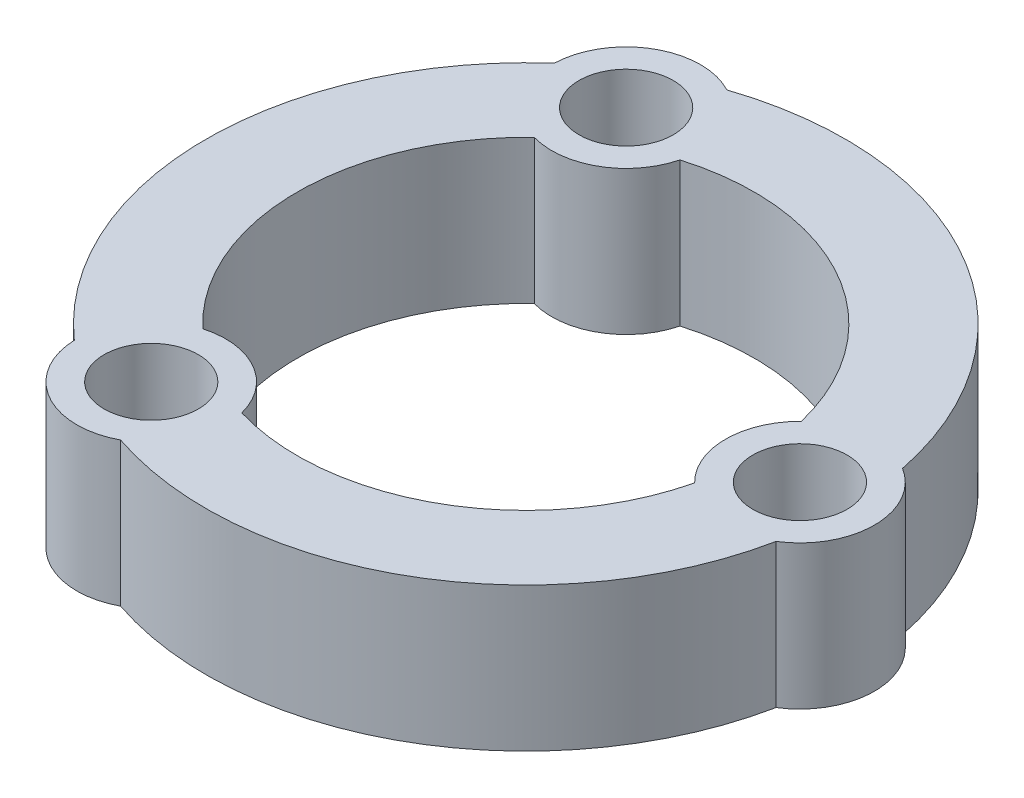
ISO-10303-21;
HEADER;
FILE_DESCRIPTION(('STEP AP214'),'2;1');
FILE_NAME('part.step','',(''),(''),'','','');
FILE_SCHEMA(('AUTOMOTIVE_DESIGN { 1 0 10303 214 1 1 1 1 }'));
ENDSEC;
DATA;
#1=APPLICATION_CONTEXT('core data for automotive mechanical design processes');
#2=APPLICATION_PROTOCOL_DEFINITION('international standard','automotive_design',2000,#1);
#3=PRODUCT_CONTEXT('',#1,'mechanical');
#4=PRODUCT('Part','Part','',(#3));
#5=PRODUCT_RELATED_PRODUCT_CATEGORY('part','',(#4));
#6=PRODUCT_DEFINITION_FORMATION('','',#4);
#7=PRODUCT_DEFINITION_CONTEXT('part definition',#1,'design');
#8=PRODUCT_DEFINITION('design','',#6,#7);
#9=PRODUCT_DEFINITION_SHAPE('','',#8);
#10=(LENGTH_UNIT() NAMED_UNIT(*) SI_UNIT(.MILLI.,.METRE.));
#11=(NAMED_UNIT(*) PLANE_ANGLE_UNIT() SI_UNIT($,.RADIAN.));
#12=(NAMED_UNIT(*) SI_UNIT($,.STERADIAN.) SOLID_ANGLE_UNIT());
#13=UNCERTAINTY_MEASURE_WITH_UNIT(LENGTH_MEASURE(1.E-05),#10,'distance_accuracy_value','');
#14=(GEOMETRIC_REPRESENTATION_CONTEXT(3) GLOBAL_UNCERTAINTY_ASSIGNED_CONTEXT((#13)) GLOBAL_UNIT_ASSIGNED_CONTEXT((#10,
#11,#12)) REPRESENTATION_CONTEXT('',''));
#15=CARTESIAN_POINT('',(0.,0.,0.));
#16=DIRECTION('',(0.,0.,1.));
#17=DIRECTION('',(1.,0.,0.));
#18=AXIS2_PLACEMENT_3D('',#15,#16,#17);
#19=CARTESIAN_POINT('',(0.,10.,0.));
#20=DIRECTION('',(0.,-1.,0.));
#21=DIRECTION('',(0.,0.,-1.));
#22=AXIS2_PLACEMENT_3D('',#19,#20,#21);
#23=CYLINDRICAL_SURFACE('',#22,22.2274999999999);
#24=CARTESIAN_POINT('',(0.,0.,0.));
#25=DIRECTION('',(0.,1.,0.));
#26=DIRECTION('',(0.,0.,1.));
#27=AXIS2_PLACEMENT_3D('',#24,#25,#26);
#28=CIRCLE('',#27,22.2274999999999);
#29=CARTESIAN_POINT('',(-14.6983234836641,0.,-16.6739630268141));
#30=VERTEX_POINT('',#29);
#31=CARTESIAN_POINT('',(-14.6983234836642,0.,16.6739630268141));
#32=VERTEX_POINT('',#31);
#33=EDGE_CURVE('E191',#30,#32,#28,.T.);
#34=ORIENTED_EDGE('',*,*,#33,.T.);
#35=DIRECTION('',(0.,-1.,0.));
#36=VECTOR('',#35,1.);
#37=CARTESIAN_POINT('',(-14.6983234836642,10.,16.6739630268141));
#38=LINE('',#37,#36);
#39=CARTESIAN_POINT('',(-14.6983234836642,10.,16.6739630268141));
#40=VERTEX_POINT('',#39);
#41=EDGE_CURVE('E13',#40,#32,#38,.T.);
#42=ORIENTED_EDGE('',*,*,#41,.F.);
#43=CARTESIAN_POINT('',(0.,10.,0.));
#44=DIRECTION('',(0.,1.,0.));
#45=DIRECTION('',(0.,0.,1.));
#46=AXIS2_PLACEMENT_3D('',#43,#44,#45);
#47=CIRCLE('',#46,22.2274999999999);
#48=CARTESIAN_POINT('',(-14.6983234836641,10.,-16.6739630268141));
#49=VERTEX_POINT('',#48);
#50=EDGE_CURVE('E256',#49,#40,#47,.T.);
#51=ORIENTED_EDGE('',*,*,#50,.F.);
#52=DIRECTION('',(0.,-1.,0.));
#53=VECTOR('',#52,1.);
#54=CARTESIAN_POINT('',(-14.6983234836641,10.,-16.6739630268141));
#55=LINE('',#54,#53);
#56=EDGE_CURVE('E202',#49,#30,#55,.T.);
#57=ORIENTED_EDGE('',*,*,#56,.T.);
#58=EDGE_LOOP('',(#34,#42,#51,#57));
#59=FACE_BOUND('',#58,.T.);
#60=ADVANCED_FACE('F48',(#59),#23,.T.);
#61=CARTESIAN_POINT('',(-9.52625,10.,16.4999490056029));
#62=DIRECTION('',(0.,-1.,0.));
#63=DIRECTION('',(0.,0.,-1.));
#64=AXIS2_PLACEMENT_3D('',#61,#62,#63);
#65=CYLINDRICAL_SURFACE('',#64,5.175);
#66=CARTESIAN_POINT('',(-9.52625,0.,16.4999490056029));
#67=DIRECTION('',(0.,1.,0.));
#68=DIRECTION('',(0.,0.,1.));
#69=AXIS2_PLACEMENT_3D('',#66,#67,#68);
#70=CIRCLE('',#69,5.175);
#71=CARTESIAN_POINT('',(-7.09091382115151,0.,21.0661030433015));
#72=VERTEX_POINT('',#71);
#73=EDGE_CURVE('E194',#32,#72,#70,.T.);
#74=ORIENTED_EDGE('',*,*,#73,.T.);
#75=DIRECTION('',(0.,-1.,0.));
#76=VECTOR('',#75,1.);
#77=CARTESIAN_POINT('',(-7.09091382115151,10.,21.0661030433015));
#78=LINE('',#77,#76);
#79=CARTESIAN_POINT('',(-7.09091382115151,10.,21.0661030433015));
#80=VERTEX_POINT('',#79);
#81=EDGE_CURVE('E58',#80,#72,#78,.T.);
#82=ORIENTED_EDGE('',*,*,#81,.F.);
#83=CARTESIAN_POINT('',(-9.52625,10.,16.4999490056029));
#84=DIRECTION('',(0.,1.,0.));
#85=DIRECTION('',(0.,0.,1.));
#86=AXIS2_PLACEMENT_3D('',#83,#84,#85);
#87=CIRCLE('',#86,5.175);
#88=EDGE_CURVE('E258',#40,#80,#87,.T.);
#89=ORIENTED_EDGE('',*,*,#88,.F.);
#90=ORIENTED_EDGE('',*,*,#41,.T.);
#91=EDGE_LOOP('',(#74,#82,#89,#90));
#92=FACE_BOUND('',#91,.T.);
#93=ADVANCED_FACE('F263',(#92),#65,.T.);
#94=CARTESIAN_POINT('',(0.,10.,0.));
#95=DIRECTION('',(0.,-1.,0.));
#96=DIRECTION('',(0.,0.,-1.));
#97=AXIS2_PLACEMENT_3D('',#94,#95,#96);
#98=CYLINDRICAL_SURFACE('',#97,22.2274999999999);
#99=CARTESIAN_POINT('',(0.,0.,0.));
#100=DIRECTION('',(0.,1.,0.));
#101=DIRECTION('',(0.,0.,1.));
#102=AXIS2_PLACEMENT_3D('',#99,#100,#101);
#103=CIRCLE('',#102,22.2274999999999);
#104=CARTESIAN_POINT('',(21.7892373048155,0.,4.39214001648747));
#105=VERTEX_POINT('',#104);
#106=EDGE_CURVE('E196',#72,#105,#103,.T.);
#107=ORIENTED_EDGE('',*,*,#106,.T.);
#108=DIRECTION('',(0.,-1.,0.));
#109=VECTOR('',#108,1.);
#110=CARTESIAN_POINT('',(21.7892373048155,10.,4.39214001648747));
#111=LINE('',#110,#109);
#112=CARTESIAN_POINT('',(21.7892373048155,10.,4.39214001648747));
#113=VERTEX_POINT('',#112);
#114=EDGE_CURVE('E163',#113,#105,#111,.T.);
#115=ORIENTED_EDGE('',*,*,#114,.F.);
#116=CARTESIAN_POINT('',(0.,10.,0.));
#117=DIRECTION('',(0.,1.,0.));
#118=DIRECTION('',(0.,0.,1.));
#119=AXIS2_PLACEMENT_3D('',#116,#117,#118);
#120=CIRCLE('',#119,22.2274999999999);
#121=EDGE_CURVE('E154',#80,#113,#120,.T.);
#122=ORIENTED_EDGE('',*,*,#121,.F.);
#123=ORIENTED_EDGE('',*,*,#81,.T.);
#124=EDGE_LOOP('',(#107,#115,#122,#123));
#125=FACE_BOUND('',#124,.T.);
#126=ADVANCED_FACE('F266',(#125),#98,.T.);
#127=CARTESIAN_POINT('',(19.0524999999998,10.,0.));
#128=DIRECTION('',(0.,-1.,0.));
#129=DIRECTION('',(0.,0.,-1.));
#130=AXIS2_PLACEMENT_3D('',#127,#128,#129);
#131=CYLINDRICAL_SURFACE('',#130,5.175);
#132=CARTESIAN_POINT('',(19.0524999999998,0.,0.));
#133=DIRECTION('',(0.,1.,0.));
#134=DIRECTION('',(0.,0.,1.));
#135=AXIS2_PLACEMENT_3D('',#132,#133,#134);
#136=CIRCLE('',#135,5.175);
#137=CARTESIAN_POINT('',(21.7892373048155,0.,-4.39214001648738));
#138=VERTEX_POINT('',#137);
#139=EDGE_CURVE('E162',#105,#138,#136,.T.);
#140=ORIENTED_EDGE('',*,*,#139,.T.);
#141=DIRECTION('',(0.,-1.,0.));
#142=VECTOR('',#141,1.);
#143=CARTESIAN_POINT('',(21.7892373048155,10.,-4.39214001648738));
#144=LINE('',#143,#142);
#145=CARTESIAN_POINT('',(21.7892373048155,10.,-4.39214001648738));
#146=VERTEX_POINT('',#145);
#147=EDGE_CURVE('E159',#146,#138,#144,.T.);
#148=ORIENTED_EDGE('',*,*,#147,.F.);
#149=CARTESIAN_POINT('',(19.0524999999998,10.,0.));
#150=DIRECTION('',(0.,1.,0.));
#151=DIRECTION('',(0.,0.,1.));
#152=AXIS2_PLACEMENT_3D('',#149,#150,#151);
#153=CIRCLE('',#152,5.175);
#154=EDGE_CURVE('E148',#113,#146,#153,.T.);
#155=ORIENTED_EDGE('',*,*,#154,.F.);
#156=ORIENTED_EDGE('',*,*,#114,.T.);
#157=EDGE_LOOP('',(#140,#148,#155,#156));
#158=FACE_BOUND('',#157,.T.);
#159=ADVANCED_FACE('F160',(#158),#131,.T.);
#160=CARTESIAN_POINT('',(0.,10.,0.));
#161=DIRECTION('',(0.,-1.,0.));
#162=DIRECTION('',(0.,0.,-1.));
#163=AXIS2_PLACEMENT_3D('',#160,#161,#162);
#164=CYLINDRICAL_SURFACE('',#163,22.2274999999999);
#165=CARTESIAN_POINT('',(0.,0.,0.));
#166=DIRECTION('',(0.,1.,0.));
#167=DIRECTION('',(0.,0.,1.));
#168=AXIS2_PLACEMENT_3D('',#165,#166,#167);
#169=CIRCLE('',#168,22.2274999999999);
#170=CARTESIAN_POINT('',(-7.09091382115139,0.,-21.0661030433016));
#171=VERTEX_POINT('',#170);
#172=EDGE_CURVE('E108',#138,#171,#169,.T.);
#173=ORIENTED_EDGE('',*,*,#172,.T.);
#174=DIRECTION('',(0.,-1.,0.));
#175=VECTOR('',#174,1.);
#176=CARTESIAN_POINT('',(-7.09091382115139,10.,-21.0661030433016));
#177=LINE('',#176,#175);
#178=CARTESIAN_POINT('',(-7.09091382115139,10.,-21.0661030433016));
#179=VERTEX_POINT('',#178);
#180=EDGE_CURVE('E164',#179,#171,#177,.T.);
#181=ORIENTED_EDGE('',*,*,#180,.F.);
#182=CARTESIAN_POINT('',(0.,10.,0.));
#183=DIRECTION('',(0.,1.,0.));
#184=DIRECTION('',(0.,0.,1.));
#185=AXIS2_PLACEMENT_3D('',#182,#183,#184);
#186=CIRCLE('',#185,22.2274999999999);
#187=EDGE_CURVE('E152',#146,#179,#186,.T.);
#188=ORIENTED_EDGE('',*,*,#187,.F.);
#189=ORIENTED_EDGE('',*,*,#147,.T.);
#190=EDGE_LOOP('',(#173,#181,#188,#189));
#191=FACE_BOUND('',#190,.T.);
#192=ADVANCED_FACE('F166',(#191),#164,.T.);
#193=CARTESIAN_POINT('',(0.,10.,0.));
#194=DIRECTION('',(0.,-1.,0.));
#195=DIRECTION('',(0.,0.,-1.));
#196=AXIS2_PLACEMENT_3D('',#193,#194,#195);
#197=CYLINDRICAL_SURFACE('',#196,15.8774999999999);
#198=CARTESIAN_POINT('',(0.,0.,0.));
#199=DIRECTION('',(0.,1.,0.));
#200=DIRECTION('',(0.,0.,1.));
#201=AXIS2_PLACEMENT_3D('',#198,#199,#200);
#202=CIRCLE('',#201,15.8774999999999);
#203=CARTESIAN_POINT('',(-4.51123615156854,0.,15.2231322215494));
#204=VERTEX_POINT('',#203);
#205=CARTESIAN_POINT('',(15.4392373048155,0.,3.70472100104573));
#206=VERTEX_POINT('',#205);
#207=EDGE_CURVE('E172',#204,#206,#202,.T.);
#208=ORIENTED_EDGE('',*,*,#207,.F.);
#209=DIRECTION('',(0.,-1.,0.));
#210=VECTOR('',#209,1.);
#211=CARTESIAN_POINT('',(-4.51123615156854,10.,15.2231322215494));
#212=LINE('',#211,#210);
#213=CARTESIAN_POINT('',(-4.51123615156854,10.,15.2231322215494));
#214=VERTEX_POINT('',#213);
#215=EDGE_CURVE('E52',#214,#204,#212,.T.);
#216=ORIENTED_EDGE('',*,*,#215,.F.);
#217=CARTESIAN_POINT('',(0.,10.,0.));
#218=DIRECTION('',(0.,1.,0.));
#219=DIRECTION('',(0.,0.,1.));
#220=AXIS2_PLACEMENT_3D('',#217,#218,#219);
#221=CIRCLE('',#220,15.8774999999999);
#222=CARTESIAN_POINT('',(15.4392373048155,10.,3.70472100104573));
#223=VERTEX_POINT('',#222);
#224=EDGE_CURVE('E201',#214,#223,#221,.T.);
#225=ORIENTED_EDGE('',*,*,#224,.T.);
#226=DIRECTION('',(0.,-1.,0.));
#227=VECTOR('',#226,1.);
#228=CARTESIAN_POINT('',(15.4392373048155,10.,3.70472100104573));
#229=LINE('',#228,#227);
#230=EDGE_CURVE('E168',#223,#206,#229,.T.);
#231=ORIENTED_EDGE('',*,*,#230,.T.);
#232=EDGE_LOOP('',(#208,#216,#225,#231));
#233=FACE_BOUND('',#232,.T.);
#234=ADVANCED_FACE('F50',(#233),#197,.F.);
#235=CARTESIAN_POINT('',(-9.52625,10.,16.4999490056029));
#236=DIRECTION('',(0.,-1.,0.));
#237=DIRECTION('',(0.,0.,-1.));
#238=AXIS2_PLACEMENT_3D('',#235,#236,#237);
#239=CYLINDRICAL_SURFACE('',#238,5.175);
#240=CARTESIAN_POINT('',(-9.52625,0.,16.4999490056029));
#241=DIRECTION('',(0.,1.,0.));
#242=DIRECTION('',(0.,0.,1.));
#243=AXIS2_PLACEMENT_3D('',#240,#241,#242);
#244=CIRCLE('',#243,5.175);
#245=CARTESIAN_POINT('',(-10.928001153247,0.,11.5184112205037));
#246=VERTEX_POINT('',#245);
#247=EDGE_CURVE('E175',#204,#246,#244,.T.);
#248=ORIENTED_EDGE('',*,*,#247,.T.);
#249=DIRECTION('',(0.,-1.,0.));
#250=VECTOR('',#249,1.);
#251=CARTESIAN_POINT('',(-10.928001153247,10.,11.5184112205037));
#252=LINE('',#251,#250);
#253=CARTESIAN_POINT('',(-10.928001153247,10.,11.5184112205037));
#254=VERTEX_POINT('',#253);
#255=EDGE_CURVE('E214',#254,#246,#252,.T.);
#256=ORIENTED_EDGE('',*,*,#255,.F.);
#257=CARTESIAN_POINT('',(-9.52625,10.,16.4999490056029));
#258=DIRECTION('',(0.,1.,0.));
#259=DIRECTION('',(0.,0.,1.));
#260=AXIS2_PLACEMENT_3D('',#257,#258,#259);
#261=CIRCLE('',#260,5.175);
#262=EDGE_CURVE('E222',#214,#254,#261,.T.);
#263=ORIENTED_EDGE('',*,*,#262,.F.);
#264=ORIENTED_EDGE('',*,*,#215,.T.);
#265=EDGE_LOOP('',(#248,#256,#263,#264));
#266=FACE_BOUND('',#265,.T.);
#267=ADVANCED_FACE('F221',(#266),#239,.T.);
#268=CARTESIAN_POINT('',(0.,10.,0.));
#269=DIRECTION('',(0.,-1.,0.));
#270=DIRECTION('',(0.,0.,-1.));
#271=AXIS2_PLACEMENT_3D('',#268,#269,#270);
#272=CYLINDRICAL_SURFACE('',#271,15.8774999999999);
#273=CARTESIAN_POINT('',(0.,0.,0.));
#274=DIRECTION('',(0.,1.,0.));
#275=DIRECTION('',(0.,0.,1.));
#276=AXIS2_PLACEMENT_3D('',#273,#274,#275);
#277=CIRCLE('',#276,15.8774999999999);
#278=CARTESIAN_POINT('',(-10.928001153247,0.,-11.5184112205038));
#279=VERTEX_POINT('',#278);
#280=EDGE_CURVE('E179',#279,#246,#277,.T.);
#281=ORIENTED_EDGE('',*,*,#280,.F.);
#282=DIRECTION('',(0.,-1.,0.));
#283=VECTOR('',#282,1.);
#284=CARTESIAN_POINT('',(-10.928001153247,10.,-11.5184112205038));
#285=LINE('',#284,#283);
#286=CARTESIAN_POINT('',(-10.928001153247,10.,-11.5184112205038));
#287=VERTEX_POINT('',#286);
#288=EDGE_CURVE('E213',#287,#279,#285,.T.);
#289=ORIENTED_EDGE('',*,*,#288,.F.);
#290=CARTESIAN_POINT('',(0.,10.,0.));
#291=DIRECTION('',(0.,1.,0.));
#292=DIRECTION('',(0.,0.,1.));
#293=AXIS2_PLACEMENT_3D('',#290,#291,#292);
#294=CIRCLE('',#293,15.8774999999999);
#295=EDGE_CURVE('E245',#287,#254,#294,.T.);
#296=ORIENTED_EDGE('',*,*,#295,.T.);
#297=ORIENTED_EDGE('',*,*,#255,.T.);
#298=EDGE_LOOP('',(#281,#289,#296,#297));
#299=FACE_BOUND('',#298,.T.);
#300=ADVANCED_FACE('F243',(#299),#272,.F.);
#301=CARTESIAN_POINT('',(-9.52624999999992,10.,-16.4999490056029));
#302=DIRECTION('',(0.,-1.,0.));
#303=DIRECTION('',(0.,0.,-1.));
#304=AXIS2_PLACEMENT_3D('',#301,#302,#303);
#305=CYLINDRICAL_SURFACE('',#304,5.175);
#306=CARTESIAN_POINT('',(-9.52624999999992,0.,-16.4999490056029));
#307=DIRECTION('',(0.,1.,0.));
#308=DIRECTION('',(0.,0.,1.));
#309=AXIS2_PLACEMENT_3D('',#306,#307,#308);
#310=CIRCLE('',#309,5.175);
#311=CARTESIAN_POINT('',(-4.51123615156845,0.,-15.2231322215494));
#312=VERTEX_POINT('',#311);
#313=EDGE_CURVE('E182',#279,#312,#310,.T.);
#314=ORIENTED_EDGE('',*,*,#313,.T.);
#315=DIRECTION('',(0.,-1.,0.));
#316=VECTOR('',#315,1.);
#317=CARTESIAN_POINT('',(-4.51123615156845,10.,-15.2231322215494));
#318=LINE('',#317,#316);
#319=CARTESIAN_POINT('',(-4.51123615156845,10.,-15.2231322215494));
#320=VERTEX_POINT('',#319);
#321=EDGE_CURVE('E211',#320,#312,#318,.T.);
#322=ORIENTED_EDGE('',*,*,#321,.F.);
#323=CARTESIAN_POINT('',(-9.52624999999992,10.,-16.4999490056029));
#324=DIRECTION('',(0.,1.,0.));
#325=DIRECTION('',(0.,0.,1.));
#326=AXIS2_PLACEMENT_3D('',#323,#324,#325);
#327=CIRCLE('',#326,5.175);
#328=EDGE_CURVE('E246',#287,#320,#327,.T.);
#329=ORIENTED_EDGE('',*,*,#328,.F.);
#330=ORIENTED_EDGE('',*,*,#288,.T.);
#331=EDGE_LOOP('',(#314,#322,#329,#330));
#332=FACE_BOUND('',#331,.T.);
#333=ADVANCED_FACE('F242',(#332),#305,.T.);
#334=CARTESIAN_POINT('',(0.,10.,0.));
#335=DIRECTION('',(0.,-1.,0.));
#336=DIRECTION('',(0.,0.,-1.));
#337=AXIS2_PLACEMENT_3D('',#334,#335,#336);
#338=CYLINDRICAL_SURFACE('',#337,15.8774999999998);
#339=CARTESIAN_POINT('',(0.,0.,0.));
#340=DIRECTION('',(0.,1.,0.));
#341=DIRECTION('',(0.,0.,1.));
#342=AXIS2_PLACEMENT_3D('',#339,#340,#341);
#343=CIRCLE('',#342,15.8774999999998);
#344=CARTESIAN_POINT('',(15.4392373048155,0.,-3.70472100104567));
#345=VERTEX_POINT('',#344);
#346=EDGE_CURVE('E185',#345,#312,#343,.T.);
#347=ORIENTED_EDGE('',*,*,#346,.F.);
#348=DIRECTION('',(0.,-1.,0.));
#349=VECTOR('',#348,1.);
#350=CARTESIAN_POINT('',(15.4392373048155,10.,-3.70472100104567));
#351=LINE('',#350,#349);
#352=CARTESIAN_POINT('',(15.4392373048155,10.,-3.70472100104567));
#353=VERTEX_POINT('',#352);
#354=EDGE_CURVE('E209',#353,#345,#351,.T.);
#355=ORIENTED_EDGE('',*,*,#354,.F.);
#356=CARTESIAN_POINT('',(0.,10.,0.));
#357=DIRECTION('',(0.,1.,0.));
#358=DIRECTION('',(0.,0.,1.));
#359=AXIS2_PLACEMENT_3D('',#356,#357,#358);
#360=CIRCLE('',#359,15.8774999999998);
#361=EDGE_CURVE('E239',#353,#320,#360,.T.);
#362=ORIENTED_EDGE('',*,*,#361,.T.);
#363=ORIENTED_EDGE('',*,*,#321,.T.);
#364=EDGE_LOOP('',(#347,#355,#362,#363));
#365=FACE_BOUND('',#364,.T.);
#366=ADVANCED_FACE('F235',(#365),#338,.F.);
#367=CARTESIAN_POINT('',(19.0524999999998,10.,0.));
#368=DIRECTION('',(0.,-1.,0.));
#369=DIRECTION('',(0.,0.,-1.));
#370=AXIS2_PLACEMENT_3D('',#367,#368,#369);
#371=CYLINDRICAL_SURFACE('',#370,5.175);
#372=CARTESIAN_POINT('',(19.0524999999998,0.,0.));
#373=DIRECTION('',(0.,1.,0.));
#374=DIRECTION('',(0.,0.,1.));
#375=AXIS2_PLACEMENT_3D('',#372,#373,#374);
#376=CIRCLE('',#375,5.175);
#377=EDGE_CURVE('E188',#345,#206,#376,.T.);
#378=ORIENTED_EDGE('',*,*,#377,.T.);
#379=ORIENTED_EDGE('',*,*,#230,.F.);
#380=CARTESIAN_POINT('',(19.0524999999998,10.,0.));
#381=DIRECTION('',(0.,1.,0.));
#382=DIRECTION('',(0.,0.,1.));
#383=AXIS2_PLACEMENT_3D('',#380,#381,#382);
#384=CIRCLE('',#383,5.175);
#385=EDGE_CURVE('E254',#353,#223,#384,.T.);
#386=ORIENTED_EDGE('',*,*,#385,.F.);
#387=ORIENTED_EDGE('',*,*,#354,.T.);
#388=EDGE_LOOP('',(#378,#379,#386,#387));
#389=FACE_BOUND('',#388,.T.);
#390=ADVANCED_FACE('F232',(#389),#371,.T.);
#391=CARTESIAN_POINT('',(-9.52624999999992,10.,-16.4999490056029));
#392=DIRECTION('',(0.,-1.,0.));
#393=DIRECTION('',(0.,0.,-1.));
#394=AXIS2_PLACEMENT_3D('',#391,#392,#393);
#395=CYLINDRICAL_SURFACE('',#394,5.175);
#396=CARTESIAN_POINT('',(-9.52624999999992,0.,-16.4999490056029));
#397=DIRECTION('',(0.,1.,0.));
#398=DIRECTION('',(0.,0.,1.));
#399=AXIS2_PLACEMENT_3D('',#396,#397,#398);
#400=CIRCLE('',#399,5.175);
#401=EDGE_CURVE('E114',#171,#30,#400,.T.);
#402=ORIENTED_EDGE('',*,*,#401,.T.);
#403=ORIENTED_EDGE('',*,*,#56,.F.);
#404=CARTESIAN_POINT('',(-9.52624999999992,10.,-16.4999490056029));
#405=DIRECTION('',(0.,1.,0.));
#406=DIRECTION('',(0.,0.,1.));
#407=AXIS2_PLACEMENT_3D('',#404,#405,#406);
#408=CIRCLE('',#407,5.175);
#409=EDGE_CURVE('E67',#179,#49,#408,.T.);
#410=ORIENTED_EDGE('',*,*,#409,.F.);
#411=ORIENTED_EDGE('',*,*,#180,.T.);
#412=EDGE_LOOP('',(#402,#403,#410,#411));
#413=FACE_BOUND('',#412,.T.);
#414=ADVANCED_FACE('F269',(#413),#395,.T.);
#415=CARTESIAN_POINT('',(0.,10.,0.));
#416=DIRECTION('',(0.,1.,0.));
#417=DIRECTION('',(0.,0.,1.));
#418=AXIS2_PLACEMENT_3D('',#415,#416,#417);
#419=PLANE('',#418);
#420=CARTESIAN_POINT('',(-9.52624999999981,10.,16.499949005603));
#421=DIRECTION('',(0.,1.,0.));
#422=DIRECTION('',(-0.866025403784443,0.,-0.499999999999992));
#423=AXIS2_PLACEMENT_3D('',#420,#421,#422);
#424=CIRCLE('',#423,3.275);
#425=CARTESIAN_POINT('',(-12.3624831973939,10.,14.862449005603));
#426=VERTEX_POINT('',#425);
#427=EDGE_CURVE('E435',#426,#426,#424,.T.);
#428=ORIENTED_EDGE('',*,*,#427,.F.);
#429=EDGE_LOOP('',(#428));
#430=FACE_BOUND('',#429,.T.);
#431=CARTESIAN_POINT('',(-9.52624999999997,10.,-16.4999490056029));
#432=DIRECTION('',(0.,1.,0.));
#433=DIRECTION('',(0.866025403784436,0.,-0.500000000000004));
#434=AXIS2_PLACEMENT_3D('',#431,#432,#433);
#435=CIRCLE('',#434,3.275);
#436=CARTESIAN_POINT('',(-6.69001680260594,10.,-18.1374490056029));
#437=VERTEX_POINT('',#436);
#438=EDGE_CURVE('E434',#437,#437,#435,.T.);
#439=ORIENTED_EDGE('',*,*,#438,.F.);
#440=EDGE_LOOP('',(#439));
#441=FACE_BOUND('',#440,.T.);
#442=CARTESIAN_POINT('',(19.0524999999998,10.,0.));
#443=DIRECTION('',(0.,1.,0.));
#444=DIRECTION('',(0.,0.,1.));
#445=AXIS2_PLACEMENT_3D('',#442,#443,#444);
#446=CIRCLE('',#445,3.275);
#447=CARTESIAN_POINT('',(19.0524999999998,10.,3.27500000000004));
#448=VERTEX_POINT('',#447);
#449=EDGE_CURVE('E444',#448,#448,#446,.T.);
#450=ORIENTED_EDGE('',*,*,#449,.F.);
#451=EDGE_LOOP('',(#450));
#452=FACE_BOUND('',#451,.T.);
#453=ORIENTED_EDGE('',*,*,#224,.F.);
#454=ORIENTED_EDGE('',*,*,#262,.T.);
#455=ORIENTED_EDGE('',*,*,#295,.F.);
#456=ORIENTED_EDGE('',*,*,#328,.T.);
#457=ORIENTED_EDGE('',*,*,#361,.F.);
#458=ORIENTED_EDGE('',*,*,#385,.T.);
#459=EDGE_LOOP('',(#453,#454,#455,#456,#457,#458));
#460=FACE_BOUND('',#459,.T.);
#461=ORIENTED_EDGE('',*,*,#50,.T.);
#462=ORIENTED_EDGE('',*,*,#88,.T.);
#463=ORIENTED_EDGE('',*,*,#121,.T.);
#464=ORIENTED_EDGE('',*,*,#154,.T.);
#465=ORIENTED_EDGE('',*,*,#187,.T.);
#466=ORIENTED_EDGE('',*,*,#409,.T.);
#467=EDGE_LOOP('',(#461,#462,#463,#464,#465,#466));
#468=FACE_BOUND('',#467,.T.);
#469=ADVANCED_FACE('F150',(#430,#441,#452,#460,#468),#419,.T.);
#470=CARTESIAN_POINT('',(0.,0.,0.));
#471=DIRECTION('',(0.,1.,0.));
#472=DIRECTION('',(0.,0.,1.));
#473=AXIS2_PLACEMENT_3D('',#470,#471,#472);
#474=PLANE('',#473);
#475=ORIENTED_EDGE('',*,*,#207,.T.);
#476=ORIENTED_EDGE('',*,*,#377,.F.);
#477=ORIENTED_EDGE('',*,*,#346,.T.);
#478=ORIENTED_EDGE('',*,*,#313,.F.);
#479=ORIENTED_EDGE('',*,*,#280,.T.);
#480=ORIENTED_EDGE('',*,*,#247,.F.);
#481=EDGE_LOOP('',(#475,#476,#477,#478,#479,#480));
#482=FACE_BOUND('',#481,.T.);
#483=ORIENTED_EDGE('',*,*,#33,.F.);
#484=ORIENTED_EDGE('',*,*,#401,.F.);
#485=ORIENTED_EDGE('',*,*,#172,.F.);
#486=ORIENTED_EDGE('',*,*,#139,.F.);
#487=ORIENTED_EDGE('',*,*,#106,.F.);
#488=ORIENTED_EDGE('',*,*,#73,.F.);
#489=EDGE_LOOP('',(#483,#484,#485,#486,#487,#488));
#490=FACE_BOUND('',#489,.T.);
#491=ADVANCED_FACE('F225',(#482,#490),#474,.F.);
#492=CARTESIAN_POINT('',(19.0524999999998,2.5,0.));
#493=DIRECTION('',(0.,1.,0.));
#494=DIRECTION('',(0.,0.,1.));
#495=AXIS2_PLACEMENT_3D('',#492,#493,#494);
#496=CYLINDRICAL_SURFACE('',#495,3.275);
#497=CARTESIAN_POINT('',(19.0524999999998,2.5,0.));
#498=DIRECTION('',(0.,1.,0.));
#499=DIRECTION('',(0.,0.,1.));
#500=AXIS2_PLACEMENT_3D('',#497,#498,#499);
#501=CIRCLE('',#500,3.275);
#502=CARTESIAN_POINT('',(19.0524999999998,2.5,3.27500000000004));
#503=VERTEX_POINT('',#502);
#504=EDGE_CURVE('E176',#503,#503,#501,.T.);
#505=ORIENTED_EDGE('',*,*,#504,.F.);
#506=EDGE_LOOP('',(#505));
#507=FACE_BOUND('',#506,.T.);
#508=ORIENTED_EDGE('',*,*,#449,.T.);
#509=EDGE_LOOP('',(#508));
#510=FACE_BOUND('',#509,.T.);
#511=ADVANCED_FACE('F364',(#507,#510),#496,.F.);
#512=CARTESIAN_POINT('',(19.0524999999998,2.5,0.));
#513=DIRECTION('',(0.,1.,0.));
#514=DIRECTION('',(0.,0.,1.));
#515=AXIS2_PLACEMENT_3D('',#512,#513,#514);
#516=PLANE('',#515);
#517=ORIENTED_EDGE('',*,*,#504,.T.);
#518=EDGE_LOOP('',(#517));
#519=FACE_BOUND('',#518,.T.);
#520=ADVANCED_FACE('F372',(#519),#516,.T.);
#521=CARTESIAN_POINT('',(-9.52624999999997,2.5,-16.4999490056029));
#522=DIRECTION('',(0.,1.,0.));
#523=DIRECTION('',(0.,0.,1.));
#524=AXIS2_PLACEMENT_3D('',#521,#522,#523);
#525=CYLINDRICAL_SURFACE('',#524,3.275);
#526=CARTESIAN_POINT('',(-9.52624999999997,2.5,-16.4999490056029));
#527=DIRECTION('',(0.,1.,0.));
#528=DIRECTION('',(0.866025403784436,0.,-0.500000000000004));
#529=AXIS2_PLACEMENT_3D('',#526,#527,#528);
#530=CIRCLE('',#529,3.275);
#531=CARTESIAN_POINT('',(-6.69001680260594,2.5,-18.1374490056029));
#532=VERTEX_POINT('',#531);
#533=EDGE_CURVE('E438',#532,#532,#530,.T.);
#534=ORIENTED_EDGE('',*,*,#533,.F.);
#535=EDGE_LOOP('',(#534));
#536=FACE_BOUND('',#535,.T.);
#537=ORIENTED_EDGE('',*,*,#438,.T.);
#538=EDGE_LOOP('',(#537));
#539=FACE_BOUND('',#538,.T.);
#540=ADVANCED_FACE('F382',(#536,#539),#525,.F.);
#541=CARTESIAN_POINT('',(-9.52624999999997,2.5,-16.4999490056029));
#542=DIRECTION('',(0.,1.,0.));
#543=DIRECTION('',(0.866025403784436,0.,-0.500000000000004));
#544=AXIS2_PLACEMENT_3D('',#541,#542,#543);
#545=PLANE('',#544);
#546=ORIENTED_EDGE('',*,*,#533,.T.);
#547=EDGE_LOOP('',(#546));
#548=FACE_BOUND('',#547,.T.);
#549=ADVANCED_FACE('F397',(#548),#545,.T.);
#550=CARTESIAN_POINT('',(-9.52624999999981,2.5,16.499949005603));
#551=DIRECTION('',(0.,1.,0.));
#552=DIRECTION('',(0.,0.,1.));
#553=AXIS2_PLACEMENT_3D('',#550,#551,#552);
#554=CYLINDRICAL_SURFACE('',#553,3.275);
#555=CARTESIAN_POINT('',(-9.52624999999981,2.5,16.499949005603));
#556=DIRECTION('',(0.,1.,0.));
#557=DIRECTION('',(-0.866025403784443,0.,-0.499999999999992));
#558=AXIS2_PLACEMENT_3D('',#555,#556,#557);
#559=CIRCLE('',#558,3.275);
#560=CARTESIAN_POINT('',(-12.3624831973939,2.5,14.862449005603));
#561=VERTEX_POINT('',#560);
#562=EDGE_CURVE('E433',#561,#561,#559,.T.);
#563=ORIENTED_EDGE('',*,*,#562,.F.);
#564=EDGE_LOOP('',(#563));
#565=FACE_BOUND('',#564,.T.);
#566=ORIENTED_EDGE('',*,*,#427,.T.);
#567=EDGE_LOOP('',(#566));
#568=FACE_BOUND('',#567,.T.);
#569=ADVANCED_FACE('F407',(#565,#568),#554,.F.);
#570=CARTESIAN_POINT('',(-9.52624999999981,2.5,16.499949005603));
#571=DIRECTION('',(0.,1.,0.));
#572=DIRECTION('',(-0.866025403784443,0.,-0.499999999999992));
#573=AXIS2_PLACEMENT_3D('',#570,#571,#572);
#574=PLANE('',#573);
#575=ORIENTED_EDGE('',*,*,#562,.T.);
#576=EDGE_LOOP('',(#575));
#577=FACE_BOUND('',#576,.T.);
#578=ADVANCED_FACE('F417',(#577),#574,.T.);
#579=CLOSED_SHELL('',(#60,#93,#126,#159,#192,#234,#267,#300,#333,#366,#390,#414,#469,#491,#511,
#520,#540,#549,#569,#578));
#580=MANIFOLD_SOLID_BREP('B2',#579);
#581=ADVANCED_BREP_SHAPE_REPRESENTATION('',(#18,#580),#14);
#582=SHAPE_DEFINITION_REPRESENTATION(#9,#581);
ENDSEC;
END-ISO-10303-21;
